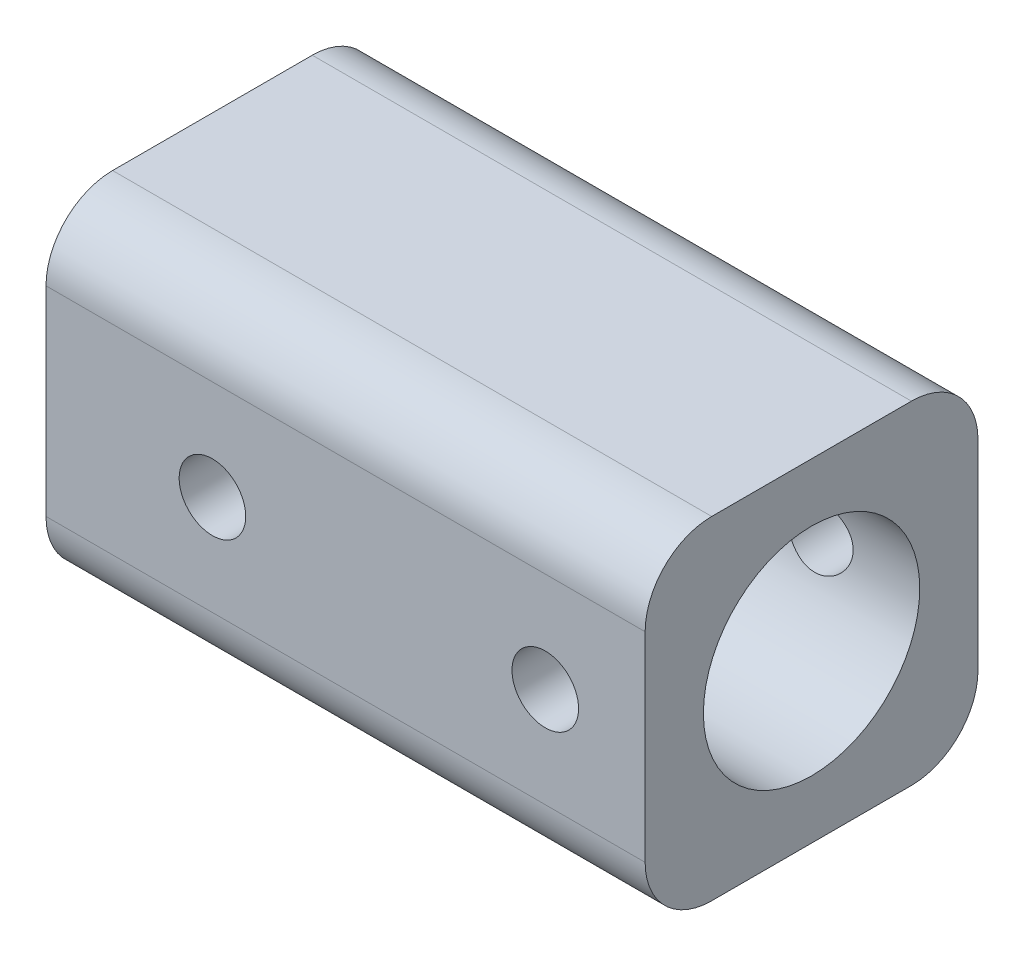
ISO-10303-21;
HEADER;
FILE_DESCRIPTION(('STEP AP214'),'2;1');
FILE_NAME('part.step','',(''),(''),'','','');
FILE_SCHEMA(('AUTOMOTIVE_DESIGN { 1 0 10303 214 1 1 1 1 }'));
ENDSEC;
DATA;
#1=APPLICATION_CONTEXT('core data for automotive mechanical design processes');
#2=APPLICATION_PROTOCOL_DEFINITION('international standard','automotive_design',2000,#1);
#3=PRODUCT_CONTEXT('',#1,'mechanical');
#4=PRODUCT('Part','Part','',(#3));
#5=PRODUCT_RELATED_PRODUCT_CATEGORY('part','',(#4));
#6=PRODUCT_DEFINITION_FORMATION('','',#4);
#7=PRODUCT_DEFINITION_CONTEXT('part definition',#1,'design');
#8=PRODUCT_DEFINITION('design','',#6,#7);
#9=PRODUCT_DEFINITION_SHAPE('','',#8);
#10=(LENGTH_UNIT() NAMED_UNIT(*) SI_UNIT(.MILLI.,.METRE.));
#11=(NAMED_UNIT(*) PLANE_ANGLE_UNIT() SI_UNIT($,.RADIAN.));
#12=(NAMED_UNIT(*) SI_UNIT($,.STERADIAN.) SOLID_ANGLE_UNIT());
#13=UNCERTAINTY_MEASURE_WITH_UNIT(LENGTH_MEASURE(1.E-05),#10,'distance_accuracy_value','');
#14=(GEOMETRIC_REPRESENTATION_CONTEXT(3) GLOBAL_UNCERTAINTY_ASSIGNED_CONTEXT((#13)) GLOBAL_UNIT_ASSIGNED_CONTEXT((#10,
#11,#12)) REPRESENTATION_CONTEXT('',''));
#15=CARTESIAN_POINT('',(0.,0.,0.));
#16=DIRECTION('',(0.,0.,1.));
#17=DIRECTION('',(1.,0.,0.));
#18=AXIS2_PLACEMENT_3D('',#15,#16,#17);
#19=CARTESIAN_POINT('',(18.,0.,0.));
#20=DIRECTION('',(0.,-1.,0.));
#21=DIRECTION('',(0.,0.,-1.));
#22=AXIS2_PLACEMENT_3D('',#19,#20,#21);
#23=PLANE('',#22);
#24=DIRECTION('',(0.,0.,1.));
#25=VECTOR('',#24,1.);
#26=CARTESIAN_POINT('',(0.,0.,0.));
#27=LINE('',#26,#25);
#28=CARTESIAN_POINT('',(0.,0.,2.));
#29=VERTEX_POINT('',#28);
#30=CARTESIAN_POINT('',(0.,0.,8.));
#31=VERTEX_POINT('',#30);
#32=EDGE_CURVE('E253',#29,#31,#27,.T.);
#33=ORIENTED_EDGE('',*,*,#32,.F.);
#34=DIRECTION('',(-1.,0.,0.));
#35=VECTOR('',#34,1.);
#36=CARTESIAN_POINT('',(18.,0.,2.));
#37=LINE('',#36,#35);
#38=CARTESIAN_POINT('',(18.,0.,2.));
#39=VERTEX_POINT('',#38);
#40=EDGE_CURVE('E106',#29,#39,#37,.F.);
#41=ORIENTED_EDGE('',*,*,#40,.T.);
#42=DIRECTION('',(0.,0.,1.));
#43=VECTOR('',#42,1.);
#44=CARTESIAN_POINT('',(18.,0.,0.));
#45=LINE('',#44,#43);
#46=CARTESIAN_POINT('',(18.,0.,8.));
#47=VERTEX_POINT('',#46);
#48=EDGE_CURVE('E127',#39,#47,#45,.T.);
#49=ORIENTED_EDGE('',*,*,#48,.T.);
#50=DIRECTION('',(-1.,0.,0.));
#51=VECTOR('',#50,1.);
#52=CARTESIAN_POINT('',(18.,0.,8.));
#53=LINE('',#52,#51);
#54=EDGE_CURVE('E111',#47,#31,#53,.T.);
#55=ORIENTED_EDGE('',*,*,#54,.T.);
#56=EDGE_LOOP('',(#33,#41,#49,#55));
#57=FACE_BOUND('',#56,.T.);
#58=ADVANCED_FACE('F35',(#57),#23,.T.);
#59=CARTESIAN_POINT('',(18.,0.,0.));
#60=DIRECTION('',(0.,0.,1.));
#61=DIRECTION('',(0.,-1.,0.));
#62=AXIS2_PLACEMENT_3D('',#59,#60,#61);
#63=PLANE('',#62);
#64=CARTESIAN_POINT('',(15.,5.,0.));
#65=DIRECTION('',(0.,0.,-1.));
#66=DIRECTION('',(0.,1.,0.));
#67=AXIS2_PLACEMENT_3D('',#64,#65,#66);
#68=CIRCLE('',#67,1.);
#69=CARTESIAN_POINT('',(15.,6.,0.));
#70=VERTEX_POINT('',#69);
#71=EDGE_CURVE('E273',#70,#70,#68,.T.);
#72=ORIENTED_EDGE('',*,*,#71,.F.);
#73=EDGE_LOOP('',(#72));
#74=FACE_BOUND('',#73,.T.);
#75=CARTESIAN_POINT('',(5.,5.,0.));
#76=DIRECTION('',(0.,0.,-1.));
#77=DIRECTION('',(0.,1.,0.));
#78=AXIS2_PLACEMENT_3D('',#75,#76,#77);
#79=CIRCLE('',#78,1.);
#80=CARTESIAN_POINT('',(5.,6.,0.));
#81=VERTEX_POINT('',#80);
#82=EDGE_CURVE('E267',#81,#81,#79,.T.);
#83=ORIENTED_EDGE('',*,*,#82,.F.);
#84=EDGE_LOOP('',(#83));
#85=FACE_BOUND('',#84,.T.);
#86=DIRECTION('',(0.,1.,0.));
#87=VECTOR('',#86,1.);
#88=CARTESIAN_POINT('',(18.,0.,0.));
#89=LINE('',#88,#87);
#90=CARTESIAN_POINT('',(18.,2.,0.));
#91=VERTEX_POINT('',#90);
#92=CARTESIAN_POINT('',(18.,8.,0.));
#93=VERTEX_POINT('',#92);
#94=EDGE_CURVE('E121',#91,#93,#89,.T.);
#95=ORIENTED_EDGE('',*,*,#94,.F.);
#96=DIRECTION('',(-1.,0.,0.));
#97=VECTOR('',#96,1.);
#98=CARTESIAN_POINT('',(0.,2.,0.));
#99=LINE('',#98,#97);
#100=CARTESIAN_POINT('',(0.,2.,0.));
#101=VERTEX_POINT('',#100);
#102=EDGE_CURVE('E105',#91,#101,#99,.T.);
#103=ORIENTED_EDGE('',*,*,#102,.T.);
#104=DIRECTION('',(0.,1.,0.));
#105=VECTOR('',#104,1.);
#106=CARTESIAN_POINT('',(0.,0.,0.));
#107=LINE('',#106,#105);
#108=CARTESIAN_POINT('',(0.,8.,0.));
#109=VERTEX_POINT('',#108);
#110=EDGE_CURVE('E118',#101,#109,#107,.T.);
#111=ORIENTED_EDGE('',*,*,#110,.T.);
#112=DIRECTION('',(-1.,0.,0.));
#113=VECTOR('',#112,1.);
#114=CARTESIAN_POINT('',(18.,8.,0.));
#115=LINE('',#114,#113);
#116=EDGE_CURVE('E123',#109,#93,#115,.F.);
#117=ORIENTED_EDGE('',*,*,#116,.T.);
#118=EDGE_LOOP('',(#95,#103,#111,#117));
#119=FACE_BOUND('',#118,.T.);
#120=ADVANCED_FACE('F117',(#74,#85,#119),#63,.F.);
#121=CARTESIAN_POINT('',(18.,10.,0.));
#122=DIRECTION('',(0.,-1.,0.));
#123=DIRECTION('',(0.,0.,-1.));
#124=AXIS2_PLACEMENT_3D('',#121,#122,#123);
#125=PLANE('',#124);
#126=DIRECTION('',(0.,0.,1.));
#127=VECTOR('',#126,1.);
#128=CARTESIAN_POINT('',(18.,10.,0.));
#129=LINE('',#128,#127);
#130=CARTESIAN_POINT('',(18.,10.,2.));
#131=VERTEX_POINT('',#130);
#132=CARTESIAN_POINT('',(18.,10.,8.));
#133=VERTEX_POINT('',#132);
#134=EDGE_CURVE('E242',#131,#133,#129,.T.);
#135=ORIENTED_EDGE('',*,*,#134,.F.);
#136=DIRECTION('',(-1.,0.,0.));
#137=VECTOR('',#136,1.);
#138=CARTESIAN_POINT('',(18.,10.,2.));
#139=LINE('',#138,#137);
#140=CARTESIAN_POINT('',(0.,10.,2.));
#141=VERTEX_POINT('',#140);
#142=EDGE_CURVE('E238',#131,#141,#139,.T.);
#143=ORIENTED_EDGE('',*,*,#142,.T.);
#144=DIRECTION('',(0.,0.,1.));
#145=VECTOR('',#144,1.);
#146=CARTESIAN_POINT('',(0.,10.,0.));
#147=LINE('',#146,#145);
#148=CARTESIAN_POINT('',(0.,10.,8.));
#149=VERTEX_POINT('',#148);
#150=EDGE_CURVE('E128',#141,#149,#147,.T.);
#151=ORIENTED_EDGE('',*,*,#150,.T.);
#152=DIRECTION('',(-1.,0.,0.));
#153=VECTOR('',#152,1.);
#154=CARTESIAN_POINT('',(18.,10.,8.));
#155=LINE('',#154,#153);
#156=EDGE_CURVE('E227',#149,#133,#155,.F.);
#157=ORIENTED_EDGE('',*,*,#156,.T.);
#158=EDGE_LOOP('',(#135,#143,#151,#157));
#159=FACE_BOUND('',#158,.T.);
#160=ADVANCED_FACE('F202',(#159),#125,.F.);
#161=CARTESIAN_POINT('',(18.,0.,10.));
#162=DIRECTION('',(0.,0.,1.));
#163=DIRECTION('',(0.,-1.,0.));
#164=AXIS2_PLACEMENT_3D('',#161,#162,#163);
#165=PLANE('',#164);
#166=CARTESIAN_POINT('',(15.,5.,10.));
#167=DIRECTION('',(0.,0.,-1.));
#168=DIRECTION('',(0.,1.,0.));
#169=AXIS2_PLACEMENT_3D('',#166,#167,#168);
#170=CIRCLE('',#169,1.);
#171=CARTESIAN_POINT('',(15.,6.,10.));
#172=VERTEX_POINT('',#171);
#173=EDGE_CURVE('E152',#172,#172,#170,.T.);
#174=ORIENTED_EDGE('',*,*,#173,.T.);
#175=EDGE_LOOP('',(#174));
#176=FACE_BOUND('',#175,.T.);
#177=CARTESIAN_POINT('',(5.,5.,10.));
#178=DIRECTION('',(0.,0.,-1.));
#179=DIRECTION('',(0.,1.,0.));
#180=AXIS2_PLACEMENT_3D('',#177,#178,#179);
#181=CIRCLE('',#180,1.);
#182=CARTESIAN_POINT('',(5.,6.,10.));
#183=VERTEX_POINT('',#182);
#184=EDGE_CURVE('E270',#183,#183,#181,.T.);
#185=ORIENTED_EDGE('',*,*,#184,.T.);
#186=EDGE_LOOP('',(#185));
#187=FACE_BOUND('',#186,.T.);
#188=DIRECTION('',(0.,1.,0.));
#189=VECTOR('',#188,1.);
#190=CARTESIAN_POINT('',(18.,0.,10.));
#191=LINE('',#190,#189);
#192=CARTESIAN_POINT('',(18.,2.,10.));
#193=VERTEX_POINT('',#192);
#194=CARTESIAN_POINT('',(18.,8.,10.));
#195=VERTEX_POINT('',#194);
#196=EDGE_CURVE('E131',#193,#195,#191,.T.);
#197=ORIENTED_EDGE('',*,*,#196,.T.);
#198=DIRECTION('',(-1.,0.,0.));
#199=VECTOR('',#198,1.);
#200=CARTESIAN_POINT('',(0.,8.,10.));
#201=LINE('',#200,#199);
#202=CARTESIAN_POINT('',(0.,8.,10.));
#203=VERTEX_POINT('',#202);
#204=EDGE_CURVE('E11',#195,#203,#201,.T.);
#205=ORIENTED_EDGE('',*,*,#204,.T.);
#206=DIRECTION('',(0.,1.,0.));
#207=VECTOR('',#206,1.);
#208=CARTESIAN_POINT('',(0.,0.,10.));
#209=LINE('',#208,#207);
#210=CARTESIAN_POINT('',(0.,2.,10.));
#211=VERTEX_POINT('',#210);
#212=EDGE_CURVE('E134',#211,#203,#209,.T.);
#213=ORIENTED_EDGE('',*,*,#212,.F.);
#214=DIRECTION('',(-1.,0.,0.));
#215=VECTOR('',#214,1.);
#216=CARTESIAN_POINT('',(18.,2.,10.));
#217=LINE('',#216,#215);
#218=EDGE_CURVE('E43',#211,#193,#217,.F.);
#219=ORIENTED_EDGE('',*,*,#218,.T.);
#220=EDGE_LOOP('',(#197,#205,#213,#219));
#221=FACE_BOUND('',#220,.T.);
#222=ADVANCED_FACE('F195',(#176,#187,#221),#165,.T.);
#223=CARTESIAN_POINT('',(18.,0.,0.));
#224=DIRECTION('',(-1.,0.,0.));
#225=DIRECTION('',(0.,0.,1.));
#226=AXIS2_PLACEMENT_3D('',#223,#224,#225);
#227=PLANE('',#226);
#228=CARTESIAN_POINT('',(18.,5.,5.));
#229=DIRECTION('',(1.,0.,0.));
#230=DIRECTION('',(0.,0.,-1.));
#231=AXIS2_PLACEMENT_3D('',#228,#229,#230);
#232=CIRCLE('',#231,3.25);
#233=CARTESIAN_POINT('',(18.,5.,1.75));
#234=VERTEX_POINT('',#233);
#235=EDGE_CURVE('E141',#234,#234,#232,.T.);
#236=ORIENTED_EDGE('',*,*,#235,.F.);
#237=EDGE_LOOP('',(#236));
#238=FACE_BOUND('',#237,.T.);
#239=ORIENTED_EDGE('',*,*,#48,.F.);
#240=CARTESIAN_POINT('',(18.,2.,2.));
#241=DIRECTION('',(-1.,0.,0.));
#242=DIRECTION('',(0.,0.,1.));
#243=AXIS2_PLACEMENT_3D('',#240,#241,#242);
#244=CIRCLE('',#243,2.);
#245=EDGE_CURVE('E231',#39,#91,#244,.F.);
#246=ORIENTED_EDGE('',*,*,#245,.T.);
#247=ORIENTED_EDGE('',*,*,#94,.T.);
#248=CARTESIAN_POINT('',(18.,8.,2.));
#249=DIRECTION('',(-1.,0.,0.));
#250=DIRECTION('',(0.,0.,1.));
#251=AXIS2_PLACEMENT_3D('',#248,#249,#250);
#252=CIRCLE('',#251,2.);
#253=EDGE_CURVE('E228',#93,#131,#252,.F.);
#254=ORIENTED_EDGE('',*,*,#253,.T.);
#255=ORIENTED_EDGE('',*,*,#134,.T.);
#256=CARTESIAN_POINT('',(18.,8.,8.));
#257=DIRECTION('',(-1.,0.,0.));
#258=DIRECTION('',(0.,0.,1.));
#259=AXIS2_PLACEMENT_3D('',#256,#257,#258);
#260=CIRCLE('',#259,2.);
#261=EDGE_CURVE('E50',#133,#195,#260,.F.);
#262=ORIENTED_EDGE('',*,*,#261,.T.);
#263=ORIENTED_EDGE('',*,*,#196,.F.);
#264=CARTESIAN_POINT('',(18.,2.,8.));
#265=DIRECTION('',(-1.,0.,0.));
#266=DIRECTION('',(0.,0.,1.));
#267=AXIS2_PLACEMENT_3D('',#264,#265,#266);
#268=CIRCLE('',#267,2.);
#269=EDGE_CURVE('E229',#193,#47,#268,.F.);
#270=ORIENTED_EDGE('',*,*,#269,.T.);
#271=EDGE_LOOP('',(#239,#246,#247,#254,#255,#262,#263,#270));
#272=FACE_BOUND('',#271,.T.);
#273=ADVANCED_FACE('F191',(#238,#272),#227,.F.);
#274=CARTESIAN_POINT('',(0.,0.,0.));
#275=DIRECTION('',(-1.,0.,0.));
#276=DIRECTION('',(0.,0.,1.));
#277=AXIS2_PLACEMENT_3D('',#274,#275,#276);
#278=PLANE('',#277);
#279=CARTESIAN_POINT('',(0.,5.,5.));
#280=DIRECTION('',(-1.,0.,0.));
#281=DIRECTION('',(0.,0.,1.));
#282=AXIS2_PLACEMENT_3D('',#279,#280,#281);
#283=CIRCLE('',#282,3.);
#284=CARTESIAN_POINT('',(0.,5.,8.));
#285=VERTEX_POINT('',#284);
#286=EDGE_CURVE('E142',#285,#285,#283,.T.);
#287=ORIENTED_EDGE('',*,*,#286,.F.);
#288=EDGE_LOOP('',(#287));
#289=FACE_BOUND('',#288,.T.);
#290=ORIENTED_EDGE('',*,*,#110,.F.);
#291=CARTESIAN_POINT('',(0.,2.,2.));
#292=DIRECTION('',(-1.,0.,0.));
#293=DIRECTION('',(0.,0.,1.));
#294=AXIS2_PLACEMENT_3D('',#291,#292,#293);
#295=CIRCLE('',#294,2.);
#296=EDGE_CURVE('E101',#101,#29,#295,.T.);
#297=ORIENTED_EDGE('',*,*,#296,.T.);
#298=ORIENTED_EDGE('',*,*,#32,.T.);
#299=CARTESIAN_POINT('',(0.,2.,8.));
#300=DIRECTION('',(-1.,0.,0.));
#301=DIRECTION('',(0.,0.,1.));
#302=AXIS2_PLACEMENT_3D('',#299,#300,#301);
#303=CIRCLE('',#302,2.);
#304=EDGE_CURVE('E122',#31,#211,#303,.T.);
#305=ORIENTED_EDGE('',*,*,#304,.T.);
#306=ORIENTED_EDGE('',*,*,#212,.T.);
#307=CARTESIAN_POINT('',(0.,8.,8.));
#308=DIRECTION('',(-1.,0.,0.));
#309=DIRECTION('',(0.,0.,1.));
#310=AXIS2_PLACEMENT_3D('',#307,#308,#309);
#311=CIRCLE('',#310,2.);
#312=EDGE_CURVE('E245',#203,#149,#311,.T.);
#313=ORIENTED_EDGE('',*,*,#312,.T.);
#314=ORIENTED_EDGE('',*,*,#150,.F.);
#315=CARTESIAN_POINT('',(0.,8.,2.));
#316=DIRECTION('',(-1.,0.,0.));
#317=DIRECTION('',(0.,0.,1.));
#318=AXIS2_PLACEMENT_3D('',#315,#316,#317);
#319=CIRCLE('',#318,2.);
#320=EDGE_CURVE('E112',#141,#109,#319,.T.);
#321=ORIENTED_EDGE('',*,*,#320,.T.);
#322=EDGE_LOOP('',(#290,#297,#298,#305,#306,#313,#314,#321));
#323=FACE_BOUND('',#322,.T.);
#324=ADVANCED_FACE('F125',(#289,#323),#278,.T.);
#325=CARTESIAN_POINT('',(9.,5.,5.));
#326=DIRECTION('',(1.,0.,0.));
#327=DIRECTION('',(0.,0.,-1.));
#328=AXIS2_PLACEMENT_3D('',#325,#326,#327);
#329=CYLINDRICAL_SURFACE('',#328,3.25);
#330=CARTESIAN_POINT('',(14.,5.,1.75));
#331=CARTESIAN_POINT('',(14.0000004804605,5.05479323577704,1.75000035406282));
#332=CARTESIAN_POINT('',(14.0045183238016,5.10959138067474,1.75139882103535));
#333=CARTESIAN_POINT('',(14.0224247059676,5.21758776449219,1.75684072367464));
#334=CARTESIAN_POINT('',(14.0358154995663,5.27078559315014,1.76088483164232));
#335=CARTESIAN_POINT('',(14.0709753534464,5.37400827349235,1.77117570756162));
#336=CARTESIAN_POINT('',(14.0927316803884,5.42403781354517,1.77741912669381));
#337=CARTESIAN_POINT('',(14.1439516036836,5.51973872768359,1.7914623204103));
#338=CARTESIAN_POINT('',(14.1734163421169,5.56540945459678,1.79926232557809));
#339=CARTESIAN_POINT('',(14.24014883772,5.6524684962384,1.81585123796691));
#340=CARTESIAN_POINT('',(14.2776062096216,5.69370744282919,1.82466119706256));
#341=CARTESIAN_POINT('',(14.358856811754,5.76942854134936,1.84215373592329));
#342=CARTESIAN_POINT('',(14.402651174136,5.80390948331297,1.85083629262103));
#343=CARTESIAN_POINT('',(14.4966143022137,5.86593638092463,1.8673156107717));
#344=CARTESIAN_POINT('',(14.5469101446489,5.89329740680999,1.87508631977958));
#345=CARTESIAN_POINT('',(14.6516669818686,5.9391112209079,1.88854625806513));
#346=CARTESIAN_POINT('',(14.7061269133272,5.95756627457332,1.89423601659442));
#347=CARTESIAN_POINT('',(14.8159836530262,5.98450080256594,1.90266995499354));
#348=CARTESIAN_POINT('',(14.8713062668036,5.99325669777995,1.90549554981143));
#349=CARTESIAN_POINT('',(14.9827018702862,6.00140777947709,1.90812314749575));
#350=CARTESIAN_POINT('',(15.0387746637587,6.0008053678641,1.9079259261986));
#351=CARTESIAN_POINT('',(15.1478075352995,5.99047349114161,1.90460215318554));
#352=CARTESIAN_POINT('',(15.2008047126611,5.98109342351427,1.90158774634431));
#353=CARTESIAN_POINT('',(15.3044333482985,5.95403822625464,1.89315113872475));
#354=CARTESIAN_POINT('',(15.3550645615529,5.9363622395742,1.88772868917557));
#355=CARTESIAN_POINT('',(15.4533650239225,5.892966108504,1.87499964639025));
#356=CARTESIAN_POINT('',(15.5009817428142,5.86713485413576,1.8676672891323));
#357=CARTESIAN_POINT('',(15.5913202721858,5.80823862924127,1.85195663211889));
#358=CARTESIAN_POINT('',(15.634040839803,5.77517182817871,1.84357806791203));
#359=CARTESIAN_POINT('',(15.715352194166,5.70102057065727,1.82626724008236));
#360=CARTESIAN_POINT('',(15.7536781412833,5.65964708147926,1.81732684443424));
#361=CARTESIAN_POINT('',(15.8229111021716,5.57094885441236,1.80022584733379));
#362=CARTESIAN_POINT('',(15.8538175993202,5.52362370245382,1.79206530020675));
#363=CARTESIAN_POINT('',(15.9075064885638,5.42386646184878,1.77736221566113));
#364=CARTESIAN_POINT('',(15.9302274320194,5.37139935948345,1.77083202500491));
#365=CARTESIAN_POINT('',(15.9664431269793,5.26314046745489,1.76021448840263));
#366=CARTESIAN_POINT('',(15.9799405910053,5.20734966050788,1.75612642429908));
#367=CARTESIAN_POINT('',(15.9968790232875,5.09627641621612,1.75096854964077));
#368=CARTESIAN_POINT('',(16.0006786762828,5.04105359336406,1.74979113942846));
#369=CARTESIAN_POINT('',(15.999122616756,4.93075441099613,1.75026999841698));
#370=CARTESIAN_POINT('',(15.9937681965315,4.87567803190585,1.75192586763849));
#371=CARTESIAN_POINT('',(15.9743447589449,4.76860709927426,1.75781462575885));
#372=CARTESIAN_POINT('',(15.9604876764169,4.71657032060996,1.76198480112932));
#373=CARTESIAN_POINT('',(15.9247094617865,4.61557359431532,1.77241636731847));
#374=CARTESIAN_POINT('',(15.902787343362,4.56661402387319,1.77867801390718));
#375=CARTESIAN_POINT('',(15.8509144025949,4.47186019277663,1.79283308544408));
#376=CARTESIAN_POINT('',(15.8207841616171,4.42616959240207,1.80076194362924));
#377=CARTESIAN_POINT('',(15.7535665849599,4.34037196583806,1.81734333188903));
#378=CARTESIAN_POINT('',(15.7164774175131,4.30026641462999,1.82599605216959));
#379=CARTESIAN_POINT('',(15.6347083502743,4.22518235995405,1.8434667704356));
#380=CARTESIAN_POINT('',(15.5897919620208,4.19045934495773,1.8522783882352));
#381=CARTESIAN_POINT('',(15.4945783327036,4.12902256113657,1.86872018347523));
#382=CARTESIAN_POINT('',(15.444281200359,4.10230863052774,1.87635038477886));
#383=CARTESIAN_POINT('',(15.339860871524,4.05782146116906,1.88947936562706));
#384=CARTESIAN_POINT('',(15.2857548650621,4.04001066446693,1.89498707598072));
#385=CARTESIAN_POINT('',(15.1751086920808,4.01381236936976,1.90320711977636));
#386=CARTESIAN_POINT('',(15.1185694233961,4.00542142563498,1.90592047523207));
#387=CARTESIAN_POINT('',(15.0073259639656,3.99854338105209,1.90814033814637));
#388=CARTESIAN_POINT('',(14.9526499977505,3.9996381963938,1.90778222740842));
#389=CARTESIAN_POINT('',(14.8443010805937,4.01069571718641,1.90422707436087));
#390=CARTESIAN_POINT('',(14.790628085607,4.02065803228669,1.90103015701661));
#391=CARTESIAN_POINT('',(14.6865312857238,4.0488917106641,1.89225074714892));
#392=CARTESIAN_POINT('',(14.6360729471556,4.06704691750894,1.88670166747938));
#393=CARTESIAN_POINT('',(14.5388782216892,4.11105999376064,1.87385079492851));
#394=CARTESIAN_POINT('',(14.4921425773062,4.13691939496674,1.86654865354789));
#395=CARTESIAN_POINT('',(14.4017937462592,4.19675913562023,1.85066741784618));
#396=CARTESIAN_POINT('',(14.3583672529336,4.23101123991338,1.84205028379749));
#397=CARTESIAN_POINT('',(14.2777429665104,4.30618164121059,1.82468868165283));
#398=CARTESIAN_POINT('',(14.2405468248568,4.34710169999887,1.81594418046191));
#399=CARTESIAN_POINT('',(14.1722754102015,4.43598841461238,1.79898478792943));
#400=CARTESIAN_POINT('',(14.1414282123326,4.48413556715735,1.79079504681012));
#401=CARTESIAN_POINT('',(14.0883077716738,4.5851844039951,1.77617808470705));
#402=CARTESIAN_POINT('',(14.0660309066895,4.6380840679838,1.76975011945147));
#403=CARTESIAN_POINT('',(14.0324496439699,4.74203517371429,1.759873258268));
#404=CARTESIAN_POINT('',(14.0203152644554,4.79279837074224,1.75620232597276));
#405=CARTESIAN_POINT('',(14.0040909703384,4.89570640408574,1.75126575454463));
#406=CARTESIAN_POINT('',(13.9999995427256,4.94785097867083,1.74999966302355));
#407=CARTESIAN_POINT('',(14.,5.,1.75));
#408=B_SPLINE_CURVE_WITH_KNOTS('',3,(#330,#331,#332,#333,#334,#335,#336,#337,#338,#339,#340,
#341,#342,#343,#344,#345,#346,#347,#348,#349,#350,#351,#352,#353,#354,#355,#356,#357,#358,#359,
#360,#361,#362,#363,#364,#365,#366,#367,#368,#369,#370,#371,#372,#373,#374,#375,#376,#377,#378,
#379,#380,#381,#382,#383,#384,#385,#386,#387,#388,#389,#390,#391,#392,#393,#394,#395,#396,#397,
#398,#399,#400,#401,#402,#403,#404,#405,#406,#407),.UNSPECIFIED.,.T.,.F.,(4,2,2,2,2,2,2,2,2,2,2,
2,2,2,2,2,2,2,2,2,2,2,2,2,2,2,2,2,2,2,2,2,2,2,2,2,2,2,4),(0.,0.164188074176602,
0.328417887460232,0.492398706659822,0.656403835068971,0.824848009810257,0.993322315615957,
1.16581309987692,1.33825998370974,1.5056545637311,1.67300618095446,1.83396742975997,
1.99494531107074,2.15821862294086,2.32153328952977,2.49204253997149,2.66256365966814,
2.83433943781324,3.00606467686202,3.17133983324618,3.33659165935418,3.49788296100021,
3.65919399449491,3.82436162674905,3.98957279649661,4.1611174390105,4.33265861607871,
4.50346990581857,4.6742187004369,4.83748137854003,5.00073687011515,5.16174715132055,
5.32278946705122,5.48996474235128,5.65718425996786,5.82963876285307,6.00202029870236,
6.15831438165327,6.31457906032768),.UNSPECIFIED.);
#409=CARTESIAN_POINT('',(14.,5.,1.75));
#410=VERTEX_POINT('',#409);
#411=EDGE_CURVE('E179',#410,#410,#408,.T.);
#412=ORIENTED_EDGE('',*,*,#411,.T.);
#413=EDGE_LOOP('',(#412));
#414=FACE_BOUND('',#413,.T.);
#415=CARTESIAN_POINT('',(15.,6.,8.09232921921325));
#416=CARTESIAN_POINT('',(14.9452760916843,5.99999950478141,8.0923296512312));
#417=CARTESIAN_POINT('',(14.890547257631,5.99549267918064,8.09379776076875));
#418=CARTESIAN_POINT('',(14.7826944092036,5.97763402551664,8.0994865883936));
#419=CARTESIAN_POINT('',(14.7295708727778,5.96427958984695,8.10370811797523));
#420=CARTESIAN_POINT('',(14.6265060959967,5.92922592526126,8.11438136959698));
#421=CARTESIAN_POINT('',(14.5765595296165,5.90754111585531,8.12082923600522));
#422=CARTESIAN_POINT('',(14.481000074555,5.85649009158311,8.13522334520361));
#423=CARTESIAN_POINT('',(14.4353879083842,5.827122599125,8.14316983714632));
#424=CARTESIAN_POINT('',(14.3482732152628,5.76049271405897,8.1599625974141));
#425=CARTESIAN_POINT('',(14.3069362882536,5.72301877904272,8.16882878465902));
#426=CARTESIAN_POINT('',(14.2310231409585,5.64169268112378,8.18629219215698));
#427=CARTESIAN_POINT('',(14.1964478350091,5.59783965700846,8.19488937590231));
#428=CARTESIAN_POINT('',(14.1343131810002,5.50381484552084,8.21107333554402));
#429=CARTESIAN_POINT('',(14.1069237160735,5.45352588962334,8.21863391695391));
#430=CARTESIAN_POINT('',(14.0610555289953,5.34878324930582,8.23166065372453));
#431=CARTESIAN_POINT('',(14.0425747798408,5.29433051554154,8.23712728546412));
#432=CARTESIAN_POINT('',(14.0155996426937,5.18453939483448,8.24520921153282));
#433=CARTESIAN_POINT('',(14.006822361639,5.12927655449841,8.24790510751213));
#434=CARTESIAN_POINT('',(13.9986076967866,5.0180012402605,8.25042615923367));
#435=CARTESIAN_POINT('',(13.9991682527221,4.96198893444308,8.25025194822609));
#436=CARTESIAN_POINT('',(14.0094257773641,4.85279321788942,8.24710886893665));
#437=CARTESIAN_POINT('',(14.0188162023508,4.79957788336448,8.24423376970839));
#438=CARTESIAN_POINT('',(14.0459647952084,4.69551874698145,8.23612675944775));
#439=CARTESIAN_POINT('',(14.0637235029864,4.644675098373,8.23089469634918));
#440=CARTESIAN_POINT('',(14.1073056217093,4.54608700802147,8.21853430480238));
#441=CARTESIAN_POINT('',(14.1332233695411,4.49838714481976,8.21138394730239));
#442=CARTESIAN_POINT('',(14.1923125962028,4.40791719423993,8.19594231277709));
#443=CARTESIAN_POINT('',(14.2254858659594,4.36514832799872,8.18765075424952));
#444=CARTESIAN_POINT('',(14.2997245553351,4.2839259092808,8.17041518178158));
#445=CARTESIAN_POINT('',(14.3410549925403,4.24571697683202,8.16145834289484));
#446=CARTESIAN_POINT('',(14.4296219696612,4.17670105420609,8.14419270454828));
#447=CARTESIAN_POINT('',(14.4768591608655,4.14589488136582,8.13588397671459));
#448=CARTESIAN_POINT('',(14.5765715341221,4.09228592357605,8.12079192042371));
#449=CARTESIAN_POINT('',(14.6290967073911,4.06957097875299,8.11402560491274));
#450=CARTESIAN_POINT('',(14.737484358664,4.0333838304511,8.10298489474776));
#451=CARTESIAN_POINT('',(14.7933456735798,4.0199084259796,8.09870963715634));
#452=CARTESIAN_POINT('',(14.9044822640719,4.00304908080261,8.09332581667684));
#453=CARTESIAN_POINT('',(14.9596952401097,3.99929161396556,8.09210011272455));
#454=CARTESIAN_POINT('',(15.069965692978,4.00092834079598,8.09262945241755));
#455=CARTESIAN_POINT('',(15.1250231917236,4.0063211728307,8.09438405257139));
#456=CARTESIAN_POINT('',(15.2318313023744,4.02577204310685,8.10056091486206));
#457=CARTESIAN_POINT('',(15.2836312848997,4.03958538948661,8.10490777368371));
#458=CARTESIAN_POINT('',(15.3841734410428,4.07519927841259,8.11570016722374));
#459=CARTESIAN_POINT('',(15.4329151246574,4.0970010970707,8.1221460372286));
#460=CARTESIAN_POINT('',(15.5274654558159,4.14866958183897,8.13663411772449));
#461=CARTESIAN_POINT('',(15.5731539260699,4.17874477615551,8.14471593700507));
#462=CARTESIAN_POINT('',(15.6589717727755,4.24586122139732,8.1614821043009));
#463=CARTESIAN_POINT('',(15.6990997447014,4.28290422677122,8.17016660371871));
#464=CARTESIAN_POINT('',(15.7743122893184,4.36466772051178,8.18757991372455));
#465=CARTESIAN_POINT('',(15.8091309738506,4.40963600936449,8.19629660570264));
#466=CARTESIAN_POINT('',(15.8707370180717,4.50498685350576,8.21244402494332));
#467=CARTESIAN_POINT('',(15.8975247590597,4.55536915158962,8.21987481325191));
#468=CARTESIAN_POINT('',(15.9420505514997,4.65979782505453,8.23256947755694));
#469=CARTESIAN_POINT('',(15.9598550708011,4.71381383371777,8.23784921165464));
#470=CARTESIAN_POINT('',(15.9860708828778,4.82426389559845,8.24571676850756));
#471=CARTESIAN_POINT('',(15.9944850165507,4.8806972121336,8.24830540539114));
#472=CARTESIAN_POINT('',(16.0014561253085,4.99192871077205,8.2504468551437));
#473=CARTESIAN_POINT('',(16.0003977455919,5.04670079653962,8.25011813618901));
#474=CARTESIAN_POINT('',(15.9893799012474,5.15525196077506,8.24674380508069));
#475=CARTESIAN_POINT('',(15.9794209870634,5.20903110044069,8.24369836093998));
#476=CARTESIAN_POINT('',(15.9511270938781,5.31344807666435,8.23526882704456));
#477=CARTESIAN_POINT('',(15.9328923766616,5.36411550055222,8.22991276786459));
#478=CARTESIAN_POINT('',(15.8886546830084,5.46169701440083,8.21741487167184));
#479=CARTESIAN_POINT('',(15.8626503946054,5.50861046877038,8.21027273309571));
#480=CARTESIAN_POINT('',(15.8026126318405,5.59904570395171,8.19465507030154));
#481=CARTESIAN_POINT('',(15.7683413330985,5.64240325557505,8.18614316115888));
#482=CARTESIAN_POINT('',(15.6931652552413,5.72288004577892,8.16885499061577));
#483=CARTESIAN_POINT('',(15.652258520475,5.75999743862002,8.16007865190327));
#484=CARTESIAN_POINT('',(15.5634115119261,5.82813020160934,8.14292475683927));
#485=CARTESIAN_POINT('',(15.5152888224286,5.85891377183413,8.13456878174639));
#486=CARTESIAN_POINT('',(15.4143046232634,5.91192106751183,8.11956137158915));
#487=CARTESIAN_POINT('',(15.3614451849814,5.93414851226619,8.11290919631399));
#488=CARTESIAN_POINT('',(15.2576059009003,5.9676413169084,8.10265178476689));
#489=CARTESIAN_POINT('',(15.2069168443981,5.97974105183284,8.09881882461252));
#490=CARTESIAN_POINT('',(15.1041531334895,5.99591971597262,8.09365762139024));
#491=CARTESIAN_POINT('',(15.0520787972794,6.00000047128192,8.09232880807712));
#492=CARTESIAN_POINT('',(15.,6.,8.09232921921325));
#493=B_SPLINE_CURVE_WITH_KNOTS('',3,(#415,#416,#417,#418,#419,#420,#421,#422,#423,#424,#425,
#426,#427,#428,#429,#430,#431,#432,#433,#434,#435,#436,#437,#438,#439,#440,#441,#442,#443,#444,
#445,#446,#447,#448,#449,#450,#451,#452,#453,#454,#455,#456,#457,#458,#459,#460,#461,#462,#463,
#464,#465,#466,#467,#468,#469,#470,#471,#472,#473,#474,#475,#476,#477,#478,#479,#480,#481,#482,
#483,#484,#485,#486,#487,#488,#489,#490,#491,#492),.UNSPECIFIED.,.T.,.F.,(4,2,2,2,2,2,2,2,2,2,2,
2,2,2,2,2,2,2,2,2,2,2,2,2,2,2,2,2,2,2,2,2,2,2,2,2,2,2,4),(0.,0.163979452388176,
0.328007255032056,0.491752402866524,0.655524798030862,0.82424046430852,0.99297892931899,
1.16540586187381,1.33779354353359,1.50501085883544,1.67219128039742,1.83377398595502,
1.99536711797259,2.15890185767665,2.32247700935134,2.49267060735143,2.66288298776026,
2.83489062843883,3.00683864777735,3.17207203704888,3.33728084051564,3.49790363325031,
3.65855209573433,3.82369414076313,3.98887782326075,4.16066780100948,4.33244962109383,
4.50294105155012,4.67338088879971,4.8369321855817,5.00047336841145,5.16208405231617,
5.32372204116743,5.49072431790311,5.65777590467178,5.83014409407756,6.00243727112252,
6.15852623293624,6.31457964581829),.UNSPECIFIED.);
#494=CARTESIAN_POINT('',(15.,6.,8.09232921921325));
#495=VERTEX_POINT('',#494);
#496=EDGE_CURVE('E173',#495,#495,#493,.T.);
#497=ORIENTED_EDGE('',*,*,#496,.T.);
#498=EDGE_LOOP('',(#497));
#499=FACE_BOUND('',#498,.T.);
#500=CARTESIAN_POINT('',(9.,5.,5.));
#501=DIRECTION('',(1.,0.,0.));
#502=DIRECTION('',(0.,0.,-1.));
#503=AXIS2_PLACEMENT_3D('',#500,#501,#502);
#504=CIRCLE('',#503,3.25);
#505=CARTESIAN_POINT('',(9.,5.,1.75));
#506=VERTEX_POINT('',#505);
#507=EDGE_CURVE('E255',#506,#506,#504,.T.);
#508=ORIENTED_EDGE('',*,*,#507,.F.);
#509=EDGE_LOOP('',(#508));
#510=FACE_BOUND('',#509,.T.);
#511=ORIENTED_EDGE('',*,*,#235,.T.);
#512=EDGE_LOOP('',(#511));
#513=FACE_BOUND('',#512,.T.);
#514=ADVANCED_FACE('F185',(#414,#499,#510,#513),#329,.F.);
#515=CARTESIAN_POINT('',(9.,5.,5.));
#516=DIRECTION('',(1.,0.,0.));
#517=DIRECTION('',(0.,0.,-1.));
#518=AXIS2_PLACEMENT_3D('',#515,#516,#517);
#519=PLANE('',#518);
#520=CARTESIAN_POINT('',(9.,5.,5.));
#521=DIRECTION('',(1.,0.,0.));
#522=DIRECTION('',(0.,0.,-1.));
#523=AXIS2_PLACEMENT_3D('',#520,#521,#522);
#524=CIRCLE('',#523,3.);
#525=CARTESIAN_POINT('',(9.,5.,2.));
#526=VERTEX_POINT('',#525);
#527=EDGE_CURVE('E138',#526,#526,#524,.T.);
#528=ORIENTED_EDGE('',*,*,#527,.F.);
#529=EDGE_LOOP('',(#528));
#530=FACE_BOUND('',#529,.T.);
#531=ORIENTED_EDGE('',*,*,#507,.T.);
#532=EDGE_LOOP('',(#531));
#533=FACE_BOUND('',#532,.T.);
#534=ADVANCED_FACE('F189',(#530,#533),#519,.T.);
#535=CARTESIAN_POINT('',(15.,5.,5.));
#536=DIRECTION('',(-1.,0.,0.));
#537=DIRECTION('',(0.,0.,1.));
#538=AXIS2_PLACEMENT_3D('',#535,#536,#537);
#539=CYLINDRICAL_SURFACE('',#538,3.);
#540=CARTESIAN_POINT('',(6.,5.,8.));
#541=CARTESIAN_POINT('',(6.00000025373164,5.05456336288672,8.00000015300943));
#542=CARTESIAN_POINT('',(5.99551973387278,5.10912519453855,7.99849769507545));
#543=CARTESIAN_POINT('',(5.97777089118278,5.21664176087297,7.99265210203281));
#544=CARTESIAN_POINT('',(5.96450165605108,5.26959632811882,7.98830867202152));
#545=CARTESIAN_POINT('',(5.92968075661595,5.37233278950178,7.97725307906443));
#546=CARTESIAN_POINT('',(5.90814293754073,5.42211982588604,7.97054487730853));
#547=CARTESIAN_POINT('',(5.85745882716165,5.51737493680533,7.95544445717342));
#548=CARTESIAN_POINT('',(5.8283110349974,5.56284215695871,7.94705190667778));
#549=CARTESIAN_POINT('',(5.76217419514125,5.64974167502227,7.92914094443005));
#550=CARTESIAN_POINT('',(5.72496876573951,5.69100370029831,7.91959556463785));
#551=CARTESIAN_POINT('',(5.64423284529343,5.76683269270208,7.90060314783122));
#552=CARTESIAN_POINT('',(5.60070096507149,5.80139818548946,7.89115613290549));
#553=CARTESIAN_POINT('',(5.50701488480354,5.86382494222786,7.87313332477274));
#554=CARTESIAN_POINT('',(5.45670626026788,5.89146485822103,7.86459039275688));
#555=CARTESIAN_POINT('',(5.35182390554145,5.93781887387772,7.84975305418601));
#556=CARTESIAN_POINT('',(5.29725148283725,5.95653569738676,7.84345796160746));
#557=CARTESIAN_POINT('',(5.18732677850329,5.98387346150916,7.83411303269377));
#558=CARTESIAN_POINT('',(5.13206279151093,5.99281344827177,7.83096095769611));
#559=CARTESIAN_POINT('',(5.02073624584412,6.00134112333448,7.82795656629508));
#560=CARTESIAN_POINT('',(4.96467393929081,6.00093170160472,7.8281032302273));
#561=CARTESIAN_POINT('',(4.85606336955598,5.99101990370342,7.8315901500818));
#562=CARTESIAN_POINT('',(4.80347159708098,5.98193391316699,7.83478415867533));
#563=CARTESIAN_POINT('',(4.70060658039317,5.95560616284942,7.84376657724551));
#564=CARTESIAN_POINT('',(4.65033361456493,5.93836342659187,7.84955529784108));
#565=CARTESIAN_POINT('',(4.55258725040852,5.89593905806021,7.86317911131249));
#566=CARTESIAN_POINT('',(4.50517197453047,5.87063404870726,7.87104565793117));
#567=CARTESIAN_POINT('',(4.41512909172027,5.81288910630314,7.88792558575726));
#568=CARTESIAN_POINT('',(4.37250287306662,5.780447112364,7.89693929790464));
#569=CARTESIAN_POINT('',(4.29090840183923,5.70734933268224,7.91567329167741));
#570=CARTESIAN_POINT('',(4.25224730549093,5.66635315007631,7.92540589354843));
#571=CARTESIAN_POINT('',(4.1822687333366,5.57833956997006,7.94406938387037));
#572=CARTESIAN_POINT('',(4.1509519618355,5.53132159566081,7.95300019538067));
#573=CARTESIAN_POINT('',(4.09630369976493,5.43194761304627,7.96917107937794));
#574=CARTESIAN_POINT('',(4.07305450865927,5.37954327641634,7.9763935000804));
#575=CARTESIAN_POINT('',(4.03579682604429,5.27126908336451,7.98820567144435));
#576=CARTESIAN_POINT('',(4.02178512457656,5.21540043815495,7.99279633654879));
#577=CARTESIAN_POINT('',(4.00394433397764,5.1043838295293,7.99867627071441));
#578=CARTESIAN_POINT('',(3.99970019082725,5.04930959986484,8.00010001833731));
#579=CARTESIAN_POINT('',(4.00033267359847,4.93922493003976,7.99988902694825));
#580=CARTESIAN_POINT('',(4.00520775997987,4.88421448068035,7.99825480419352));
#581=CARTESIAN_POINT('',(4.02361190773597,4.77748013369574,7.99220024717114));
#582=CARTESIAN_POINT('',(4.03688620604952,4.72570719316514,7.98786198711228));
#583=CARTESIAN_POINT('',(4.0713934444667,4.62514404142044,7.97691846830034));
#584=CARTESIAN_POINT('',(4.09262739946768,4.57635421149144,7.97031292046541));
#585=CARTESIAN_POINT('',(4.1430704318409,4.48171170360668,7.95528931287427));
#586=CARTESIAN_POINT('',(4.1724745932836,4.43597004078267,7.94682814756305));
#587=CARTESIAN_POINT('',(4.23819415001306,4.34993516986459,7.92905253915743));
#588=CARTESIAN_POINT('',(4.27451165603016,4.3096436322051,7.91973783591888));
#589=CARTESIAN_POINT('',(4.35497875100827,4.23374749219299,7.90076847982472));
#590=CARTESIAN_POINT('',(4.39940922693325,4.19843903075151,7.89111761095155));
#591=CARTESIAN_POINT('',(4.4937715678045,4.13574247767915,7.87299973286981));
#592=CARTESIAN_POINT('',(4.5437034786102,4.10835445207916,7.8645327335312));
#593=CARTESIAN_POINT('',(4.6476730153066,4.06240306957664,7.84982391820308));
#594=CARTESIAN_POINT('',(4.70170207924278,4.04382186780223,7.84357760900632));
#595=CARTESIAN_POINT('',(4.81237865012415,4.01610533320784,7.83410832399133));
#596=CARTESIAN_POINT('',(4.86902496543306,4.00696574503876,7.83088398622698));
#597=CARTESIAN_POINT('',(4.98019709601321,3.99872371752962,7.82797858875071));
#598=CARTESIAN_POINT('',(5.03468234025174,3.99912974268907,7.82812400344299));
#599=CARTESIAN_POINT('',(5.14276507489974,4.00875770654512,7.8315126992356));
#600=CARTESIAN_POINT('',(5.19636261795291,4.01797912054111,7.83475579595884));
#601=CARTESIAN_POINT('',(5.30013566301267,4.04462818687302,7.84384524278943));
#602=CARTESIAN_POINT('',(5.35035682500723,4.06189665398512,7.84964098015514));
#603=CARTESIAN_POINT('',(5.44722740693553,4.10402063423962,7.86316398825434));
#604=CARTESIAN_POINT('',(5.49387603118726,4.12887783144602,7.87089168765297));
#605=CARTESIAN_POINT('',(5.58448366992369,4.18673930741675,7.8878282922406));
#606=CARTESIAN_POINT('',(5.6282365018986,4.22005175723547,7.89708711641604));
#607=CARTESIAN_POINT('',(5.70968981338399,4.29335711686431,7.91583356283786));
#608=CARTESIAN_POINT('',(5.74738857568802,4.33335191554851,7.92532124912518));
#609=CARTESIAN_POINT('',(5.81714441228924,4.42075844307933,7.94390030525393));
#610=CARTESIAN_POINT('',(5.84892434775102,4.46839848650028,7.95296181801216));
#611=CARTESIAN_POINT('',(5.90399042885063,4.56864264259337,7.96925991172653));
#612=CARTESIAN_POINT('',(5.92727874592204,4.62124548186765,7.9764969590794));
#613=CARTESIAN_POINT('',(5.96372163248868,4.72750635279903,7.98805515068532));
#614=CARTESIAN_POINT('',(5.97728246626338,4.78101224232359,7.9924921242252));
#615=CARTESIAN_POINT('',(5.99542028067713,4.88967958398975,7.99846407064225));
#616=CARTESIAN_POINT('',(5.99999974349654,4.94484057443125,7.99999984531906));
#617=CARTESIAN_POINT('',(6.,5.,8.));
#618=B_SPLINE_CURVE_WITH_KNOTS('',3,(#540,#541,#542,#543,#544,#545,#546,#547,#548,#549,#550,
#551,#552,#553,#554,#555,#556,#557,#558,#559,#560,#561,#562,#563,#564,#565,#566,#567,#568,#569,
#570,#571,#572,#573,#574,#575,#576,#577,#578,#579,#580,#581,#582,#583,#584,#585,#586,#587,#588,
#589,#590,#591,#592,#593,#594,#595,#596,#597,#598,#599,#600,#601,#602,#603,#604,#605,#606,#607,
#608,#609,#610,#611,#612,#613,#614,#615,#616,#617),.UNSPECIFIED.,.T.,.F.,(4,2,2,2,2,2,2,2,2,2,2,
2,2,2,2,2,2,2,2,2,2,2,2,2,2,2,2,2,2,2,2,2,2,2,2,2,2,2,4),(0.,0.163487106026011,
0.326991185267521,0.490222672870274,0.6534863777991,0.82184684282756,0.990244332875303,
1.16348384823471,1.33667044692833,1.5040192574184,1.67131633987485,1.8309682655128,
1.99063930855482,2.15288171155131,2.31517102558207,2.48593305811367,2.65671145966618,
2.82918405650358,3.00159668877208,3.1665358317517,3.33144713164177,3.49158157978213,
3.65173645284104,3.81610399843737,3.98052180821891,4.15241022880752,4.32430008234997,
4.49584013824416,4.66730284700846,4.82995666056618,4.99260079341185,5.15215587070227,
5.31174638165787,5.47830066681615,5.64490211113589,5.8179966082491,5.99104681142266,
6.15636558363623,6.3216386602795),.UNSPECIFIED.);
#619=CARTESIAN_POINT('',(6.,5.,8.));
#620=VERTEX_POINT('',#619);
#621=EDGE_CURVE('E151',#620,#620,#618,.T.);
#622=ORIENTED_EDGE('',*,*,#621,.T.);
#623=EDGE_LOOP('',(#622));
#624=FACE_BOUND('',#623,.T.);
#625=CARTESIAN_POINT('',(5.,6.,2.17157287525381));
#626=CARTESIAN_POINT('',(5.05446817481068,6.0000002579478,2.17157305467265));
#627=CARTESIAN_POINT('',(5.10893479977153,5.99553478369814,2.16998230627193));
#628=CARTESIAN_POINT('',(5.21625442095062,5.97785113170256,2.1638242582542));
#629=CARTESIAN_POINT('',(5.26910714986394,5.96463151217067,2.15925646832779));
#630=CARTESIAN_POINT('',(5.37162689301281,5.92995548568026,2.14771796336112));
#631=CARTESIAN_POINT('',(5.42129992944688,5.908515221402,2.14075196035359));
#632=CARTESIAN_POINT('',(5.5163600485438,5.85806162844263,2.12520877982992));
#633=CARTESIAN_POINT('',(5.5617461825525,5.82904662886052,2.11663124694568));
#634=CARTESIAN_POINT('',(5.64871996233949,5.76305114644253,2.09845510594411));
#635=CARTESIAN_POINT('',(5.69011542867204,5.72582434137782,2.08883105155861));
#636=CARTESIAN_POINT('',(5.76620680122432,5.64498766721449,2.06986135198491));
#637=CARTESIAN_POINT('',(5.80090163158228,5.6013767750524,2.06051575170901));
#638=CARTESIAN_POINT('',(5.86347889732968,5.50760450796498,2.04286133078341));
#639=CARTESIAN_POINT('',(5.89115997061798,5.45730191122452,2.03458592298432));
#640=CARTESIAN_POINT('',(5.93759158512749,5.35243122298748,2.02030413228979));
#641=CARTESIAN_POINT('',(5.9563445331769,5.29786428568721,2.01429713796988));
#642=CARTESIAN_POINT('',(5.9837358546324,5.18802881743349,2.00540924568102));
#643=CARTESIAN_POINT('',(5.99270344625701,5.13285075485297,2.00242685222442));
#644=CARTESIAN_POINT('',(6.00131629336066,5.02169787482409,1.99956391781751));
#645=CARTESIAN_POINT('',(6.00096395165242,4.96572326645611,1.99968257737109));
#646=CARTESIAN_POINT('',(5.99115574543397,4.85689648480618,2.00293960381264));
#647=CARTESIAN_POINT('',(5.98205747152549,4.80400795140833,2.00595935244865));
#648=CARTESIAN_POINT('',(5.95560701901955,4.70055656117784,2.01453032660286));
#649=CARTESIAN_POINT('',(5.93825428102024,4.64999386222082,2.02008172368885));
#650=CARTESIAN_POINT('',(5.89557868269387,4.55184752515799,2.03324329706708));
#651=CARTESIAN_POINT('',(5.87015406145322,4.504311779031,2.0408795747573));
#652=CARTESIAN_POINT('',(5.81214029455161,4.41407567447283,2.05741606961335));
#653=CARTESIAN_POINT('',(5.77954915667336,4.37137666561523,2.06631663799482));
#654=CARTESIAN_POINT('',(5.70632560653926,4.28989913344809,2.0849380814911));
#655=CARTESIAN_POINT('',(5.66538684215456,4.25139984293244,2.09467784827333));
#656=CARTESIAN_POINT('',(5.57755127427734,4.18172274040411,2.11352664754889));
#657=CARTESIAN_POINT('',(5.53065355428676,4.15054605672699,2.1226355826855));
#658=CARTESIAN_POINT('',(5.43134637438458,4.09601254495727,2.13929474864469));
#659=CARTESIAN_POINT('',(5.37886786863219,4.07277353634895,2.14682090661179));
#660=CARTESIAN_POINT('',(5.27042860573374,4.03555680670049,2.15918349121701));
#661=CARTESIAN_POINT('',(5.21446931877818,4.02157520424447,2.16402104498777));
#662=CARTESIAN_POINT('',(5.10336164459938,4.00383871790953,2.1702036369793));
#663=CARTESIAN_POINT('',(5.04829057525428,3.99965090449425,2.17169639684861));
#664=CARTESIAN_POINT('',(4.93822385088296,4.0003945610884,2.17143327937199));
#665=CARTESIAN_POINT('',(4.88322818397524,4.00532437477274,2.16967799207232));
#666=CARTESIAN_POINT('',(4.77684303428884,4.02377434844817,2.16326381910621));
#667=CARTESIAN_POINT('',(4.72539456984936,4.03699360601945,2.15870674559406));
#668=CARTESIAN_POINT('',(4.62545639376062,4.0712861374394,2.1473144632873));
#669=CARTESIAN_POINT('',(4.57696720840916,4.09236080363654,2.14047885065093));
#670=CARTESIAN_POINT('',(4.48261957915306,4.1425256592611,2.12503122404282));
#671=CARTESIAN_POINT('',(4.43689335735821,4.17184888164151,2.1163697433439));
#672=CARTESIAN_POINT('',(4.35085394761627,4.23741436944243,2.09834231269016));
#673=CARTESIAN_POINT('',(4.31054236133878,4.27365867450122,2.088976155562));
#674=CARTESIAN_POINT('',(4.23447201590937,4.35410829409968,2.07004961362156));
#675=CARTESIAN_POINT('',(4.19902560998115,4.39861272945335,2.06050156422105));
#676=CARTESIAN_POINT('',(4.13608385765196,4.49317270859974,2.0427314838689));
#677=CARTESIAN_POINT('',(4.10858822883758,4.54322805513545,2.03450940582305));
#678=CARTESIAN_POINT('',(4.06257989513828,4.64722013756771,2.02035594189397));
#679=CARTESIAN_POINT('',(4.04400872285193,4.7011288766788,2.01440969995469));
#680=CARTESIAN_POINT('',(4.0162722579399,4.81154153415399,2.00541389162225));
#681=CARTESIAN_POINT('',(4.0071035701195,4.86804450804611,2.00236327965982));
#682=CARTESIAN_POINT('',(3.99873792239436,4.97918466413996,1.99958136763743));
#683=CARTESIAN_POINT('',(3.99909254606763,5.03378472392002,1.99970079910558));
#684=CARTESIAN_POINT('',(4.00865730814641,5.14211114500017,2.00287803480604));
#685=CARTESIAN_POINT('',(4.01786672815276,5.19583757681906,2.00593560066432));
#686=CARTESIAN_POINT('',(4.04458223457597,5.30004211943206,2.01459085045579));
#687=CARTESIAN_POINT('',(4.06195421535295,5.3505582709128,2.0201474163882));
#688=CARTESIAN_POINT('',(4.10437753109714,5.44797835093979,2.03322839295536));
#689=CARTESIAN_POINT('',(4.12943025519694,5.49488162414241,2.04075315952099));
#690=CARTESIAN_POINT('',(4.18756951210208,5.58563401630881,2.05734131171999));
#691=CARTESIAN_POINT('',(4.22091868538192,5.6293062515577,2.06645127507618));
#692=CARTESIAN_POINT('',(4.29425739115592,5.71058102627234,2.08507011208575));
#693=CARTESIAN_POINT('',(4.33424904226168,5.74818162162426,2.09457911228603));
#694=CARTESIAN_POINT('',(4.42160935558804,5.81774180883346,2.11336720172635));
#695=CARTESIAN_POINT('',(4.46920551098077,5.84942296599922,2.12262272004655));
#696=CARTESIAN_POINT('',(4.56933442689865,5.9043143432998,2.13939806683697));
#697=CARTESIAN_POINT('',(4.62186589301425,5.92752677681456,2.1469183486383));
#698=CARTESIAN_POINT('',(4.72796182402383,5.96384382820663,2.15898665769465));
#699=CARTESIAN_POINT('',(4.78137226356572,5.97735790916327,2.163653670552));
#700=CARTESIAN_POINT('',(4.88985605051548,5.99543432016169,2.1699461638606));
#701=CARTESIAN_POINT('',(4.94492881743575,5.9999997391965,2.17157269384865));
#702=CARTESIAN_POINT('',(5.,6.,2.17157287525381));
#703=B_SPLINE_CURVE_WITH_KNOTS('',3,(#625,#626,#627,#628,#629,#630,#631,#632,#633,#634,#635,
#636,#637,#638,#639,#640,#641,#642,#643,#644,#645,#646,#647,#648,#649,#650,#651,#652,#653,#654,
#655,#656,#657,#658,#659,#660,#661,#662,#663,#664,#665,#666,#667,#668,#669,#670,#671,#672,#673,
#674,#675,#676,#677,#678,#679,#680,#681,#682,#683,#684,#685,#686,#687,#688,#689,#690,#691,#692,
#693,#694,#695,#696,#697,#698,#699,#700,#701,#702),.UNSPECIFIED.,.T.,.F.,(4,2,2,2,2,2,2,2,2,2,2,
2,2,2,2,2,2,2,2,2,2,2,2,2,2,2,2,2,2,2,2,2,2,2,2,2,2,2,4),(0.,0.163200584775417,
0.326428054968881,0.489336627454546,0.652281166139159,0.821013374229398,0.989772651673597,
1.16293506139029,1.33605076382161,1.50314318760306,1.67019253297699,1.83069004820941,
1.99119844184608,2.15381654855707,2.31647991869393,2.48680174359289,2.65714979607477,
2.82992639837376,3.00263051349688,3.16754291357512,3.33242535830307,3.49164395761849,
3.65089079140019,3.81518857728788,3.979534856552,4.15178808164165,4.32403518750605,
4.49513791183924,4.66617882997229,4.82918084670708,4.99216964002854,5.15256956033503,
5.31299850756315,5.47935519513706,5.64576504425704,5.81868902729217,5.99156778259939,
6.15663212153685,6.32163947179229),.UNSPECIFIED.);
#704=CARTESIAN_POINT('',(5.,6.,2.17157287525381));
#705=VERTEX_POINT('',#704);
#706=EDGE_CURVE('E143',#705,#705,#703,.T.);
#707=ORIENTED_EDGE('',*,*,#706,.T.);
#708=EDGE_LOOP('',(#707));
#709=FACE_BOUND('',#708,.T.);
#710=ORIENTED_EDGE('',*,*,#527,.T.);
#711=EDGE_LOOP('',(#710));
#712=FACE_BOUND('',#711,.T.);
#713=ORIENTED_EDGE('',*,*,#286,.T.);
#714=EDGE_LOOP('',(#713));
#715=FACE_BOUND('',#714,.T.);
#716=ADVANCED_FACE('F157',(#624,#709,#712,#715),#539,.F.);
#717=CARTESIAN_POINT('',(5.,5.,10.));
#718=DIRECTION('',(0.,0.,-1.));
#719=DIRECTION('',(0.,1.,0.));
#720=AXIS2_PLACEMENT_3D('',#717,#718,#719);
#721=CYLINDRICAL_SURFACE('',#720,1.);
#722=ORIENTED_EDGE('',*,*,#82,.T.);
#723=EDGE_LOOP('',(#722));
#724=FACE_BOUND('',#723,.T.);
#725=ORIENTED_EDGE('',*,*,#706,.F.);
#726=EDGE_LOOP('',(#725));
#727=FACE_BOUND('',#726,.T.);
#728=ADVANCED_FACE('F165',(#724,#727),#721,.F.);
#729=ORIENTED_EDGE('',*,*,#184,.F.);
#730=EDGE_LOOP('',(#729));
#731=FACE_BOUND('',#730,.T.);
#732=ORIENTED_EDGE('',*,*,#621,.F.);
#733=EDGE_LOOP('',(#732));
#734=FACE_BOUND('',#733,.T.);
#735=ADVANCED_FACE('F160',(#731,#734),#721,.F.);
#736=CARTESIAN_POINT('',(15.,5.,10.));
#737=DIRECTION('',(0.,0.,-1.));
#738=DIRECTION('',(0.,1.,0.));
#739=AXIS2_PLACEMENT_3D('',#736,#737,#738);
#740=CYLINDRICAL_SURFACE('',#739,1.);
#741=ORIENTED_EDGE('',*,*,#173,.F.);
#742=EDGE_LOOP('',(#741));
#743=FACE_BOUND('',#742,.T.);
#744=ORIENTED_EDGE('',*,*,#496,.F.);
#745=EDGE_LOOP('',(#744));
#746=FACE_BOUND('',#745,.T.);
#747=ADVANCED_FACE('F164',(#743,#746),#740,.F.);
#748=ORIENTED_EDGE('',*,*,#71,.T.);
#749=EDGE_LOOP('',(#748));
#750=FACE_BOUND('',#749,.T.);
#751=ORIENTED_EDGE('',*,*,#411,.F.);
#752=EDGE_LOOP('',(#751));
#753=FACE_BOUND('',#752,.T.);
#754=ADVANCED_FACE('F167',(#750,#753),#740,.F.);
#755=CARTESIAN_POINT('',(18.,2.,2.));
#756=DIRECTION('',(1.,0.,0.));
#757=DIRECTION('',(0.,0.,-1.));
#758=AXIS2_PLACEMENT_3D('',#755,#756,#757);
#759=CYLINDRICAL_SURFACE('',#758,2.);
#760=ORIENTED_EDGE('',*,*,#245,.F.);
#761=ORIENTED_EDGE('',*,*,#40,.F.);
#762=ORIENTED_EDGE('',*,*,#296,.F.);
#763=ORIENTED_EDGE('',*,*,#102,.F.);
#764=EDGE_LOOP('',(#760,#761,#762,#763));
#765=FACE_BOUND('',#764,.T.);
#766=ADVANCED_FACE('F104',(#765),#759,.T.);
#767=CARTESIAN_POINT('',(18.,8.,2.));
#768=DIRECTION('',(-1.,0.,0.));
#769=DIRECTION('',(0.,0.,1.));
#770=AXIS2_PLACEMENT_3D('',#767,#768,#769);
#771=CYLINDRICAL_SURFACE('',#770,2.);
#772=ORIENTED_EDGE('',*,*,#253,.F.);
#773=ORIENTED_EDGE('',*,*,#116,.F.);
#774=ORIENTED_EDGE('',*,*,#320,.F.);
#775=ORIENTED_EDGE('',*,*,#142,.F.);
#776=EDGE_LOOP('',(#772,#773,#774,#775));
#777=FACE_BOUND('',#776,.T.);
#778=ADVANCED_FACE('F215',(#777),#771,.T.);
#779=CARTESIAN_POINT('',(18.,8.,8.));
#780=DIRECTION('',(1.,0.,0.));
#781=DIRECTION('',(0.,0.,-1.));
#782=AXIS2_PLACEMENT_3D('',#779,#780,#781);
#783=CYLINDRICAL_SURFACE('',#782,2.);
#784=ORIENTED_EDGE('',*,*,#261,.F.);
#785=ORIENTED_EDGE('',*,*,#156,.F.);
#786=ORIENTED_EDGE('',*,*,#312,.F.);
#787=ORIENTED_EDGE('',*,*,#204,.F.);
#788=EDGE_LOOP('',(#784,#785,#786,#787));
#789=FACE_BOUND('',#788,.T.);
#790=ADVANCED_FACE('F217',(#789),#783,.T.);
#791=CARTESIAN_POINT('',(18.,2.,8.));
#792=DIRECTION('',(-1.,0.,0.));
#793=DIRECTION('',(0.,0.,1.));
#794=AXIS2_PLACEMENT_3D('',#791,#792,#793);
#795=CYLINDRICAL_SURFACE('',#794,2.);
#796=ORIENTED_EDGE('',*,*,#269,.F.);
#797=ORIENTED_EDGE('',*,*,#218,.F.);
#798=ORIENTED_EDGE('',*,*,#304,.F.);
#799=ORIENTED_EDGE('',*,*,#54,.F.);
#800=EDGE_LOOP('',(#796,#797,#798,#799));
#801=FACE_BOUND('',#800,.T.);
#802=ADVANCED_FACE('F37',(#801),#795,.T.);
#803=CLOSED_SHELL('',(#58,#120,#160,#222,#273,#324,#514,#534,#716,#728,#735,#747,#754,#766,#778,
#790,#802));
#804=MANIFOLD_SOLID_BREP('B2',#803);
#805=ADVANCED_BREP_SHAPE_REPRESENTATION('',(#18,#804),#14);
#806=SHAPE_DEFINITION_REPRESENTATION(#9,#805);
ENDSEC;
END-ISO-10303-21;
